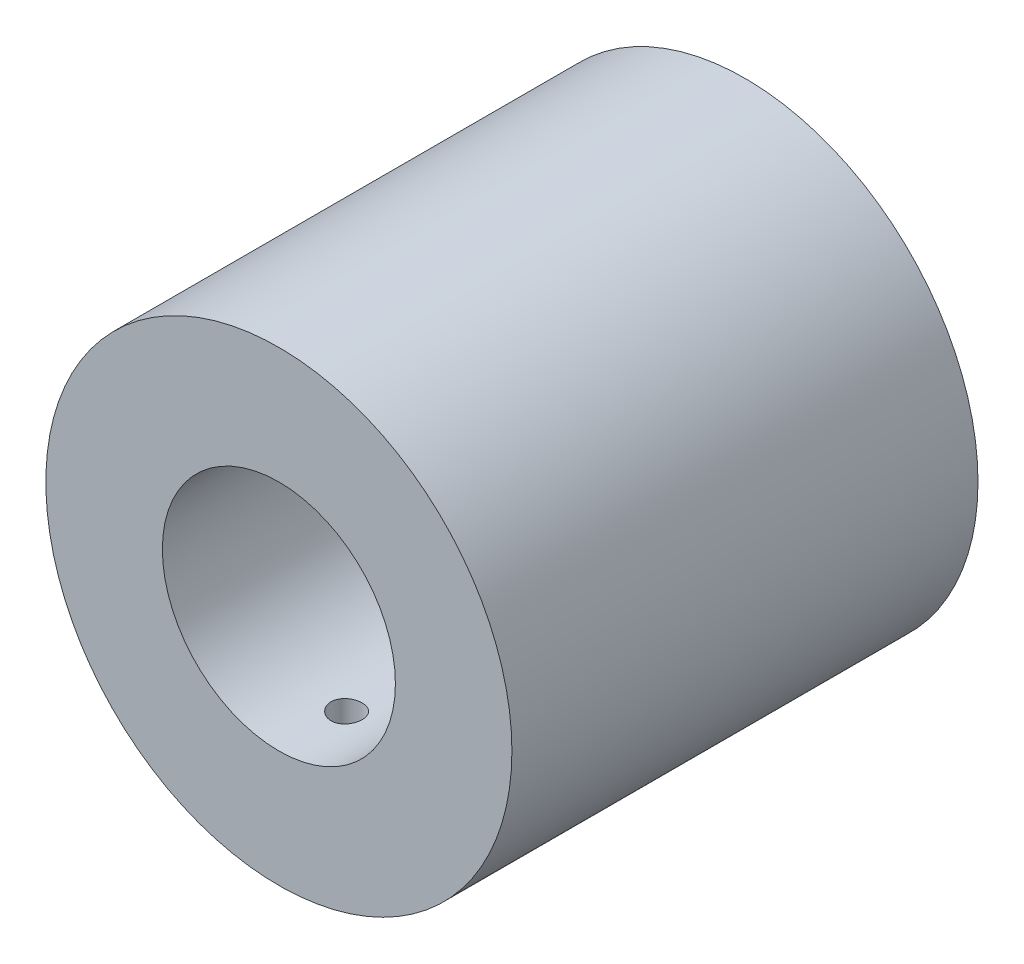
ISO-10303-21;
HEADER;
FILE_DESCRIPTION(('STEP AP214'),'2;1');
FILE_NAME('part.step','',(''),(''),'','','');
FILE_SCHEMA(('AUTOMOTIVE_DESIGN { 1 0 10303 214 1 1 1 1 }'));
ENDSEC;
DATA;
#1=APPLICATION_CONTEXT('core data for automotive mechanical design processes');
#2=APPLICATION_PROTOCOL_DEFINITION('international standard','automotive_design',2000,#1);
#3=PRODUCT_CONTEXT('',#1,'mechanical');
#4=PRODUCT('Part','Part','',(#3));
#5=PRODUCT_RELATED_PRODUCT_CATEGORY('part','',(#4));
#6=PRODUCT_DEFINITION_FORMATION('','',#4);
#7=PRODUCT_DEFINITION_CONTEXT('part definition',#1,'design');
#8=PRODUCT_DEFINITION('design','',#6,#7);
#9=PRODUCT_DEFINITION_SHAPE('','',#8);
#10=(LENGTH_UNIT() NAMED_UNIT(*) SI_UNIT(.MILLI.,.METRE.));
#11=(NAMED_UNIT(*) PLANE_ANGLE_UNIT() SI_UNIT($,.RADIAN.));
#12=(NAMED_UNIT(*) SI_UNIT($,.STERADIAN.) SOLID_ANGLE_UNIT());
#13=UNCERTAINTY_MEASURE_WITH_UNIT(LENGTH_MEASURE(1.E-05),#10,'distance_accuracy_value','');
#14=(GEOMETRIC_REPRESENTATION_CONTEXT(3) GLOBAL_UNCERTAINTY_ASSIGNED_CONTEXT((#13)) GLOBAL_UNIT_ASSIGNED_CONTEXT((#10,
#11,#12)) REPRESENTATION_CONTEXT('',''));
#15=CARTESIAN_POINT('',(0.,0.,0.));
#16=DIRECTION('',(0.,0.,1.));
#17=DIRECTION('',(1.,0.,0.));
#18=AXIS2_PLACEMENT_3D('',#15,#16,#17);
#19=CARTESIAN_POINT('',(0.,0.,30.));
#20=DIRECTION('',(0.,0.,1.));
#21=DIRECTION('',(1.,0.,0.));
#22=AXIS2_PLACEMENT_3D('',#19,#20,#21);
#23=PLANE('',#22);
#24=CARTESIAN_POINT('',(0.,0.,30.));
#25=DIRECTION('',(0.,0.,1.));
#26=DIRECTION('',(1.,0.,0.));
#27=AXIS2_PLACEMENT_3D('',#24,#25,#26);
#28=CIRCLE('',#27,15.);
#29=CARTESIAN_POINT('',(15.,0.,30.));
#30=VERTEX_POINT('',#29);
#31=EDGE_CURVE('E10',#30,#30,#28,.T.);
#32=ORIENTED_EDGE('',*,*,#31,.T.);
#33=EDGE_LOOP('',(#32));
#34=FACE_BOUND('',#33,.T.);
#35=CARTESIAN_POINT('',(0.,0.,30.));
#36=DIRECTION('',(0.,0.,1.));
#37=DIRECTION('',(1.,0.,0.));
#38=AXIS2_PLACEMENT_3D('',#35,#36,#37);
#39=CIRCLE('',#38,7.5);
#40=CARTESIAN_POINT('',(7.5,0.,30.));
#41=VERTEX_POINT('',#40);
#42=EDGE_CURVE('E51',#41,#41,#39,.T.);
#43=ORIENTED_EDGE('',*,*,#42,.F.);
#44=EDGE_LOOP('',(#43));
#45=FACE_BOUND('',#44,.T.);
#46=ADVANCED_FACE('F33',(#34,#45),#23,.T.);
#47=CARTESIAN_POINT('',(0.,0.,0.));
#48=DIRECTION('',(0.,0.,1.));
#49=DIRECTION('',(1.,0.,0.));
#50=AXIS2_PLACEMENT_3D('',#47,#48,#49);
#51=PLANE('',#50);
#52=CARTESIAN_POINT('',(0.,0.,0.));
#53=DIRECTION('',(0.,0.,1.));
#54=DIRECTION('',(1.,0.,0.));
#55=AXIS2_PLACEMENT_3D('',#52,#53,#54);
#56=CIRCLE('',#55,15.);
#57=CARTESIAN_POINT('',(15.,0.,0.));
#58=VERTEX_POINT('',#57);
#59=EDGE_CURVE('E46',#58,#58,#56,.T.);
#60=ORIENTED_EDGE('',*,*,#59,.F.);
#61=EDGE_LOOP('',(#60));
#62=FACE_BOUND('',#61,.T.);
#63=CARTESIAN_POINT('',(0.,0.,0.));
#64=DIRECTION('',(0.,0.,1.));
#65=DIRECTION('',(1.,0.,0.));
#66=AXIS2_PLACEMENT_3D('',#63,#64,#65);
#67=CIRCLE('',#66,7.5);
#68=CARTESIAN_POINT('',(7.5,0.,0.));
#69=VERTEX_POINT('',#68);
#70=EDGE_CURVE('E54',#69,#69,#67,.T.);
#71=ORIENTED_EDGE('',*,*,#70,.T.);
#72=EDGE_LOOP('',(#71));
#73=FACE_BOUND('',#72,.T.);
#74=ADVANCED_FACE('F86',(#62,#73),#51,.F.);
#75=CARTESIAN_POINT('',(0.,0.,30.));
#76=DIRECTION('',(0.,0.,-1.));
#77=DIRECTION('',(-1.,0.,0.));
#78=AXIS2_PLACEMENT_3D('',#75,#76,#77);
#79=CYLINDRICAL_SURFACE('',#78,15.);
#80=CARTESIAN_POINT('',(0.,-15.,5.36103412651882));
#81=CARTESIAN_POINT('',(0.0561035908041249,-14.9999995579846,5.36103166097059));
#82=CARTESIAN_POINT('',(0.112246272047745,-14.9996818744052,5.3562968388895));
#83=CARTESIAN_POINT('',(0.222980853460928,-14.99844511371,5.33747696678426));
#84=CARTESIAN_POINT('',(0.27757088068208,-14.9975253399424,5.32338108521855));
#85=CARTESIAN_POINT('',(0.383580167359696,-14.9951884301052,5.28624625139774));
#86=CARTESIAN_POINT('',(0.435001104032173,-14.9937715598241,5.26321207758965));
#87=CARTESIAN_POINT('',(0.53323346528299,-14.9905997328555,5.20886240934761));
#88=CARTESIAN_POINT('',(0.580045929848533,-14.9888448527116,5.1775487892304));
#89=CARTESIAN_POINT('',(0.667824599458844,-14.9851908975273,5.10747152593613));
#90=CARTESIAN_POINT('',(0.708782006678587,-14.9832916119278,5.06869687267528));
#91=CARTESIAN_POINT('',(0.783612634377517,-14.9795646978327,4.98482105472417));
#92=CARTESIAN_POINT('',(0.817485556226103,-14.9777370723604,4.93971962347659));
#93=CARTESIAN_POINT('',(0.877213460326698,-14.9743579336721,4.84441983518938));
#94=CARTESIAN_POINT('',(0.903061029326378,-14.9728066763058,4.79421682213949));
#95=CARTESIAN_POINT('',(0.945957097391599,-14.970157972686,4.69017155202204));
#96=CARTESIAN_POINT('',(0.96300570179472,-14.9690605209997,4.63632933853021));
#97=CARTESIAN_POINT('',(0.987795199392888,-14.9674452176353,4.52661968190903));
#98=CARTESIAN_POINT('',(0.995550016427559,-14.9669264989871,4.47075539791847));
#99=CARTESIAN_POINT('',(1.00157479750803,-14.9665245630443,4.35851582879268));
#100=CARTESIAN_POINT('',(0.999844881457584,-14.9666413377159,4.30214055012632));
#101=CARTESIAN_POINT('',(0.986960846772746,-14.9674964150486,4.19057425050353));
#102=CARTESIAN_POINT('',(0.975821806744587,-14.9682337232656,4.1353814795395));
#103=CARTESIAN_POINT('',(0.944459115591351,-14.9702452157825,4.02765083609035));
#104=CARTESIAN_POINT('',(0.924235403922088,-14.9715194036602,3.97511298130133));
#105=CARTESIAN_POINT('',(0.875260370110762,-14.9744622124897,3.87413515205842));
#106=CARTESIAN_POINT('',(0.846502221174381,-14.9761311489876,3.82569849822139));
#107=CARTESIAN_POINT('',(0.78127959292322,-14.9796750723207,3.7343343140076));
#108=CARTESIAN_POINT('',(0.744815014647449,-14.9815500618019,3.69140685438776));
#109=CARTESIAN_POINT('',(0.665129760832788,-14.985299217381,3.61219189179125));
#110=CARTESIAN_POINT('',(0.621896038198311,-14.9871733747298,3.57591751165685));
#111=CARTESIAN_POINT('',(0.529945441656851,-14.990706156798,3.51113966946565));
#112=CARTESIAN_POINT('',(0.481228565576779,-14.9923647814319,3.48263621048866));
#113=CARTESIAN_POINT('',(0.379686494733828,-14.9952797619227,3.43421037778455));
#114=CARTESIAN_POINT('',(0.326861055090796,-14.9965360937791,3.41428851600444));
#115=CARTESIAN_POINT('',(0.2186049960803,-14.9985046094346,3.38360022695043));
#116=CARTESIAN_POINT('',(0.163174411331704,-14.9992168004624,3.37283367805103));
#117=CARTESIAN_POINT('',(0.0513953711246012,-15.0000158534359,3.36077793226224));
#118=CARTESIAN_POINT('',(-0.00495111964684421,-15.0001039123065,3.35947059493809));
#119=CARTESIAN_POINT('',(-0.1170625716756,-14.9996479643198,3.36632296279076));
#120=CARTESIAN_POINT('',(-0.17282753638049,-14.9991039612117,3.37448261181027));
#121=CARTESIAN_POINT('',(-0.282141760529371,-14.9974458893639,3.40002230687361));
#122=CARTESIAN_POINT('',(-0.335692976508958,-14.9963323361678,3.41739401489643));
#123=CARTESIAN_POINT('',(-0.439120008014194,-14.9936604087425,3.46085623220461));
#124=CARTESIAN_POINT('',(-0.488995785972854,-14.9921020299676,3.48694683059148));
#125=CARTESIAN_POINT('',(-0.583739131383284,-14.9887124988692,3.54715228637971));
#126=CARTESIAN_POINT('',(-0.628598996013498,-14.9868809368237,3.58127924204568));
#127=CARTESIAN_POINT('',(-0.711959527646486,-14.9831524773505,3.65657108742279));
#128=CARTESIAN_POINT('',(-0.75046012362045,-14.9812555791934,3.69773605573341));
#129=CARTESIAN_POINT('',(-0.820070815484494,-14.9776067587531,3.78601374997889));
#130=CARTESIAN_POINT('',(-0.851169130356619,-14.9758550704263,3.83313577673608));
#131=CARTESIAN_POINT('',(-0.905011874107379,-14.9726979544392,3.93194330208869));
#132=CARTESIAN_POINT('',(-0.927756360237217,-14.971292524406,3.98362876940651));
#133=CARTESIAN_POINT('',(-0.964225471727894,-14.9689881146233,4.09005321781807));
#134=CARTESIAN_POINT('',(-0.977957475914838,-14.9680887206512,4.14478966103406));
#135=CARTESIAN_POINT('',(-0.996035908200023,-14.9668966664299,4.25579745807382));
#136=CARTESIAN_POINT('',(-1.0003824447804,-14.9666039991678,4.31206879414888));
#137=CARTESIAN_POINT('',(-0.999565483534788,-14.9666585741728,4.42443191615497));
#138=CARTESIAN_POINT('',(-0.994420504639091,-14.9670045703421,4.48052383827527));
#139=CARTESIAN_POINT('',(-0.974804994261808,-14.9682948425397,4.59104539398646));
#140=CARTESIAN_POINT('',(-0.960334446280208,-14.9692391196265,4.64547502463602));
#141=CARTESIAN_POINT('',(-0.92248283778284,-14.9716192360536,4.75112942078279));
#142=CARTESIAN_POINT('',(-0.899101904669178,-14.9730550683655,4.80235423209082));
#143=CARTESIAN_POINT('',(-0.844095647375272,-14.9762564813155,4.90015386843732));
#144=CARTESIAN_POINT('',(-0.812470521740287,-14.9780220540122,4.94672880542158));
#145=CARTESIAN_POINT('',(-0.741804774943629,-14.9816880295888,5.03400076551838));
#146=CARTESIAN_POINT('',(-0.702750674582998,-14.9835886735546,5.07468686385072));
#147=CARTESIAN_POINT('',(-0.618355426554708,-14.9873085213532,5.14894013578603));
#148=CARTESIAN_POINT('',(-0.573012746113305,-14.9891277051874,5.18250556874259));
#149=CARTESIAN_POINT('',(-0.477269598838892,-14.9924817745562,5.24159294406466));
#150=CARTESIAN_POINT('',(-0.426862407970513,-14.994016274223,5.26710400171267));
#151=CARTESIAN_POINT('',(-0.322506215419354,-14.9966230436255,5.30926915575046));
#152=CARTESIAN_POINT('',(-0.268561431383448,-14.9976958526619,5.3259335912224));
#153=CARTESIAN_POINT('',(-0.178573873772113,-14.9989782377769,5.34561661610703));
#154=CARTESIAN_POINT('',(-0.143112284161978,-14.9993596884566,5.35139066983633));
#155=CARTESIAN_POINT('',(-0.0717724628196567,-14.9998707107647,5.35910021069143));
#156=CARTESIAN_POINT('',(-0.0358942317520724,-15.0000002827948,5.36103570393942));
#157=CARTESIAN_POINT('',(0.,-15.,5.36103412651882));
#158=B_SPLINE_CURVE_WITH_KNOTS('',3,(#80,#81,#82,#83,#84,#85,#86,#87,#88,#89,#90,#91,#92,#93,
#94,#95,#96,#97,#98,#99,#100,#101,#102,#103,#104,#105,#106,#107,#108,#109,#110,#111,#112,#113,
#114,#115,#116,#117,#118,#119,#120,#121,#122,#123,#124,#125,#126,#127,#128,#129,#130,#131,#132,
#133,#134,#135,#136,#137,#138,#139,#140,#141,#142,#143,#144,#145,#146,#147,#148,#149,#150,#151,
#152,#153,#154,#155,#156,#157),.UNSPECIFIED.,.T.,.F.,(4,2,2,2,2,2,2,2,2,2,2,2,2,2,2,2,2,2,2,2,2,
2,2,2,2,2,2,2,2,2,2,2,2,2,2,2,2,2,4),(0.,0.168179734044292,0.336554406184462,0.504839188283248,
0.673085906323964,0.841582833287236,1.01008686142994,1.17874608173166,1.34740328286781,
1.51580748668391,1.68420956157893,1.85234227434813,2.02047610764315,2.18874479730908,
2.35701564790423,2.52561491574574,2.69421425040695,2.86282364170141,3.03143079303741,
3.19971451152963,3.36799723178317,3.53612789526984,3.70426027699717,3.87264740882398,
4.04103642129616,4.20969166582445,4.37834575448806,4.54686158747343,4.71537547265433,
4.88356091745659,5.05174665983533,5.21992999755776,5.3881092852874,5.55659668097782,
5.72512521606818,5.89388053603615,6.06243819437153,6.17003722486686,6.27763608375031),.UNSPECIFIED.);
#159=CARTESIAN_POINT('',(0.,-15.,5.36103412651882));
#160=VERTEX_POINT('',#159);
#161=EDGE_CURVE('E62',#160,#160,#158,.T.);
#162=ORIENTED_EDGE('',*,*,#161,.T.);
#163=EDGE_LOOP('',(#162));
#164=FACE_BOUND('',#163,.T.);
#165=CARTESIAN_POINT('',(0.,-15.,26.6389658734812));
#166=CARTESIAN_POINT('',(0.056103590804125,-14.9999995579846,26.6389634079329));
#167=CARTESIAN_POINT('',(0.112246272047744,-14.9996818744052,26.6342285858519));
#168=CARTESIAN_POINT('',(0.222980853460928,-14.99844511371,26.6154087137466));
#169=CARTESIAN_POINT('',(0.277570880682081,-14.9975253399424,26.6013128321809));
#170=CARTESIAN_POINT('',(0.383580167359696,-14.9951884301052,26.5641779983601));
#171=CARTESIAN_POINT('',(0.435001104032173,-14.9937715598241,26.541143824552));
#172=CARTESIAN_POINT('',(0.533233465282989,-14.9905997328555,26.48679415631));
#173=CARTESIAN_POINT('',(0.580045929848533,-14.9888448527116,26.4554805361928));
#174=CARTESIAN_POINT('',(0.667824599458843,-14.9851908975273,26.3854032728985));
#175=CARTESIAN_POINT('',(0.708782006678586,-14.9832916119278,26.3466286196376));
#176=CARTESIAN_POINT('',(0.783612634377516,-14.9795646978327,26.2627528016865));
#177=CARTESIAN_POINT('',(0.817485556226103,-14.9777370723604,26.2176513704389));
#178=CARTESIAN_POINT('',(0.877213460326698,-14.9743579336721,26.1223515821517));
#179=CARTESIAN_POINT('',(0.903061029326378,-14.9728066763058,26.0721485691019));
#180=CARTESIAN_POINT('',(0.945957097391599,-14.970157972686,25.9681032989844));
#181=CARTESIAN_POINT('',(0.963005701794719,-14.9690605209997,25.9142610854926));
#182=CARTESIAN_POINT('',(0.987795199392888,-14.9674452176353,25.8045514288714));
#183=CARTESIAN_POINT('',(0.995550016427559,-14.9669264989871,25.7486871448808));
#184=CARTESIAN_POINT('',(1.00157479750803,-14.9665245630443,25.636447575755));
#185=CARTESIAN_POINT('',(0.999844881457584,-14.9666413377159,25.5800722970887));
#186=CARTESIAN_POINT('',(0.986960846772746,-14.9674964150486,25.4685059974659));
#187=CARTESIAN_POINT('',(0.975821806744587,-14.9682337232656,25.4133132265019));
#188=CARTESIAN_POINT('',(0.944459115591351,-14.9702452157825,25.3055825830527));
#189=CARTESIAN_POINT('',(0.924235403922088,-14.9715194036602,25.2530447282637));
#190=CARTESIAN_POINT('',(0.875260370110762,-14.9744622124897,25.1520668990208));
#191=CARTESIAN_POINT('',(0.846502221174381,-14.9761311489876,25.1036302451837));
#192=CARTESIAN_POINT('',(0.78127959292322,-14.9796750723207,25.01226606097));
#193=CARTESIAN_POINT('',(0.744815014647449,-14.9815500618019,24.9693386013501));
#194=CARTESIAN_POINT('',(0.665129760832789,-14.985299217381,24.8901236387536));
#195=CARTESIAN_POINT('',(0.621896038198312,-14.9871733747298,24.8538492586192));
#196=CARTESIAN_POINT('',(0.529945441656852,-14.990706156798,24.789071416428));
#197=CARTESIAN_POINT('',(0.48122856557678,-14.9923647814319,24.760567957451));
#198=CARTESIAN_POINT('',(0.379686494733829,-14.9952797619227,24.7121421247469));
#199=CARTESIAN_POINT('',(0.326861055090798,-14.9965360937791,24.6922202629668));
#200=CARTESIAN_POINT('',(0.218604996080301,-14.9985046094346,24.6615319739128));
#201=CARTESIAN_POINT('',(0.163174411331704,-14.9992168004624,24.6507654250134));
#202=CARTESIAN_POINT('',(0.0513953711246002,-15.0000158534359,24.6387096792246));
#203=CARTESIAN_POINT('',(-0.0049511196468451,-15.0001039123065,24.6374023419004));
#204=CARTESIAN_POINT('',(-0.1170625716756,-14.9996479643198,24.6442547097531));
#205=CARTESIAN_POINT('',(-0.17282753638049,-14.9991039612117,24.6524143587726));
#206=CARTESIAN_POINT('',(-0.282141760529372,-14.9974458893639,24.677954053836));
#207=CARTESIAN_POINT('',(-0.335692976508959,-14.9963323361678,24.6953257618588));
#208=CARTESIAN_POINT('',(-0.439120008014196,-14.9936604087425,24.738787979167));
#209=CARTESIAN_POINT('',(-0.488995785972855,-14.9921020299676,24.7648785775538));
#210=CARTESIAN_POINT('',(-0.583739131383286,-14.9887124988692,24.8250840333421));
#211=CARTESIAN_POINT('',(-0.6285989960135,-14.9868809368237,24.859210989008));
#212=CARTESIAN_POINT('',(-0.711959527646489,-14.9831524773505,24.9345028343851));
#213=CARTESIAN_POINT('',(-0.750460123620452,-14.9812555791934,24.9756678026958));
#214=CARTESIAN_POINT('',(-0.820070815484495,-14.9776067587531,25.0639454969412));
#215=CARTESIAN_POINT('',(-0.851169130356619,-14.9758550704263,25.1110675236984));
#216=CARTESIAN_POINT('',(-0.905011874107379,-14.9726979544392,25.209875049051));
#217=CARTESIAN_POINT('',(-0.927756360237217,-14.971292524406,25.2615605163689));
#218=CARTESIAN_POINT('',(-0.964225471727893,-14.9689881146233,25.3679849647804));
#219=CARTESIAN_POINT('',(-0.977957475914837,-14.9680887206512,25.4227214079964));
#220=CARTESIAN_POINT('',(-0.996035908200023,-14.9668966664299,25.5337292050362));
#221=CARTESIAN_POINT('',(-1.0003824447804,-14.9666039991678,25.5900005411112));
#222=CARTESIAN_POINT('',(-0.999565483534788,-14.9666585741728,25.7023636631173));
#223=CARTESIAN_POINT('',(-0.994420504639091,-14.9670045703421,25.7584555852376));
#224=CARTESIAN_POINT('',(-0.974804994261809,-14.9682948425397,25.8689771409488));
#225=CARTESIAN_POINT('',(-0.960334446280208,-14.9692391196265,25.9234067715984));
#226=CARTESIAN_POINT('',(-0.92248283778284,-14.9716192360536,26.0290611677451));
#227=CARTESIAN_POINT('',(-0.899101904669178,-14.9730550683655,26.0802859790532));
#228=CARTESIAN_POINT('',(-0.844095647375271,-14.9762564813155,26.1780856153997));
#229=CARTESIAN_POINT('',(-0.812470521740286,-14.9780220540122,26.2246605523839));
#230=CARTESIAN_POINT('',(-0.741804774943627,-14.9816880295888,26.3119325124807));
#231=CARTESIAN_POINT('',(-0.702750674582996,-14.9835886735546,26.3526186108131));
#232=CARTESIAN_POINT('',(-0.618355426554706,-14.9873085213532,26.4268718827484));
#233=CARTESIAN_POINT('',(-0.573012746113302,-14.9891277051874,26.4604373157049));
#234=CARTESIAN_POINT('',(-0.47726959883889,-14.9924817745562,26.519524691027));
#235=CARTESIAN_POINT('',(-0.426862407970511,-14.994016274223,26.545035748675));
#236=CARTESIAN_POINT('',(-0.322506215419352,-14.9966230436255,26.5872009027128));
#237=CARTESIAN_POINT('',(-0.268561431383446,-14.9976958526619,26.6038653381848));
#238=CARTESIAN_POINT('',(-0.178573873772112,-14.9989782377769,26.6235483630694));
#239=CARTESIAN_POINT('',(-0.143112284161977,-14.9993596884566,26.6293224167987));
#240=CARTESIAN_POINT('',(-0.0717724628196561,-14.9998707107647,26.6370319576538));
#241=CARTESIAN_POINT('',(-0.0358942317520721,-15.0000002827948,26.6389674509018));
#242=CARTESIAN_POINT('',(0.,-15.,26.6389658734812));
#243=B_SPLINE_CURVE_WITH_KNOTS('',3,(#165,#166,#167,#168,#169,#170,#171,#172,#173,#174,#175,
#176,#177,#178,#179,#180,#181,#182,#183,#184,#185,#186,#187,#188,#189,#190,#191,#192,#193,#194,
#195,#196,#197,#198,#199,#200,#201,#202,#203,#204,#205,#206,#207,#208,#209,#210,#211,#212,#213,
#214,#215,#216,#217,#218,#219,#220,#221,#222,#223,#224,#225,#226,#227,#228,#229,#230,#231,#232,
#233,#234,#235,#236,#237,#238,#239,#240,#241,#242),.UNSPECIFIED.,.T.,.F.,(4,2,2,2,2,2,2,2,2,2,2,
2,2,2,2,2,2,2,2,2,2,2,2,2,2,2,2,2,2,2,2,2,2,2,2,2,2,2,4),(0.,0.168179734044292,
0.336554406184462,0.504839188283247,0.673085906323964,0.841582833287236,1.01008686142994,
1.17874608173165,1.34740328286781,1.51580748668391,1.68420956157893,1.85234227434813,
2.02047610764315,2.18874479730908,2.35701564790423,2.52561491574574,2.69421425040695,
2.86282364170141,3.03143079303741,3.19971451152963,3.36799723178317,3.53612789526984,
3.70426027699717,3.87264740882399,4.04103642129616,4.20969166582445,4.37834575448806,
4.54686158747342,4.71537547265432,4.88356091745659,5.05174665983533,5.21992999755776,
5.3881092852874,5.55659668097783,5.72512521606819,5.89388053603615,6.06243819437154,
6.17003722486686,6.27763608375031),.UNSPECIFIED.);
#244=CARTESIAN_POINT('',(0.,-15.,26.6389658734812));
#245=VERTEX_POINT('',#244);
#246=EDGE_CURVE('E61',#245,#245,#243,.T.);
#247=ORIENTED_EDGE('',*,*,#246,.T.);
#248=EDGE_LOOP('',(#247));
#249=FACE_BOUND('',#248,.T.);
#250=ORIENTED_EDGE('',*,*,#31,.F.);
#251=EDGE_LOOP('',(#250));
#252=FACE_BOUND('',#251,.T.);
#253=ORIENTED_EDGE('',*,*,#59,.T.);
#254=EDGE_LOOP('',(#253));
#255=FACE_BOUND('',#254,.T.);
#256=ADVANCED_FACE('F35',(#164,#249,#252,#255),#79,.T.);
#257=CARTESIAN_POINT('',(0.,0.,30.));
#258=DIRECTION('',(0.,0.,-1.));
#259=DIRECTION('',(-1.,0.,0.));
#260=AXIS2_PLACEMENT_3D('',#257,#258,#259);
#261=CYLINDRICAL_SURFACE('',#260,7.5);
#262=CARTESIAN_POINT('',(0.,-7.5,5.36103412651882));
#263=CARTESIAN_POINT('',(0.0559044178346421,-7.49999917871272,5.36103177166537));
#264=CARTESIAN_POINT('',(0.11184298963814,-7.49936835363597,5.35633035753759));
#265=CARTESIAN_POINT('',(0.222161362569039,-7.49691255563452,5.33765095199404));
#266=CARTESIAN_POINT('',(0.276539511166518,-7.49508636220862,5.32366347907025));
#267=CARTESIAN_POINT('',(0.382124156313492,-7.49044539924533,5.2868332677481));
#268=CARTESIAN_POINT('',(0.433332841529247,-7.48763132105486,5.2639967209996));
#269=CARTESIAN_POINT('',(0.53118194751515,-7.48132693330196,5.21013066961568));
#270=CARTESIAN_POINT('',(0.577823103168513,-7.47783673279283,5.17910248593559));
#271=CARTESIAN_POINT('',(0.665512911252339,-7.47054497394982,5.10952749571673));
#272=CARTESIAN_POINT('',(0.706528992747931,-7.46674179081055,5.07093980401459));
#273=CARTESIAN_POINT('',(0.781523678365509,-7.45926568778975,4.9874290319805));
#274=CARTESIAN_POINT('',(0.815501909986106,-7.45559277481171,4.94250561652092));
#275=CARTESIAN_POINT('',(0.875579511344537,-7.44877717720095,4.84738456504631));
#276=CARTESIAN_POINT('',(0.901648037412889,-7.44563658882881,4.79716728527951));
#277=CARTESIAN_POINT('',(0.944969225036451,-7.44026293689616,4.69301859290043));
#278=CARTESIAN_POINT('',(0.96222226622639,-7.43802983425604,4.63908734034217));
#279=CARTESIAN_POINT('',(0.987323033860869,-7.43473968284334,4.52938122126799));
#280=CARTESIAN_POINT('',(0.995226021142532,-7.43367572685068,4.47361920925236));
#281=CARTESIAN_POINT('',(1.00157340274059,-7.43282325804657,4.36155103671585));
#282=CARTESIAN_POINT('',(1.00001822816801,-7.433034687102,4.30524490111337));
#283=CARTESIAN_POINT('',(0.987538729696172,-7.43470277886495,4.19407356150486));
#284=CARTESIAN_POINT('',(0.976675487658808,-7.43615132311171,4.13920136157597));
#285=CARTESIAN_POINT('',(0.945983623171857,-7.44011776387373,4.03206570813878));
#286=CARTESIAN_POINT('',(0.926154796307286,-7.44263568477064,3.97980231414132));
#287=CARTESIAN_POINT('',(0.878029645715955,-7.44846630555513,3.87917930916522));
#288=CARTESIAN_POINT('',(0.849706989568746,-7.45178147061949,3.83083244092167));
#289=CARTESIAN_POINT('',(0.785416966721446,-7.45883118109967,3.73955458555999));
#290=CARTESIAN_POINT('',(0.749449202511925,-7.46256574831765,3.69662388024174));
#291=CARTESIAN_POINT('',(0.670552450131812,-7.47006949616793,3.61704262022787));
#292=CARTESIAN_POINT('',(0.627570853513223,-7.47383871770599,3.58044420516766));
#293=CARTESIAN_POINT('',(0.536047085066704,-7.48095961909132,3.51497310405463));
#294=CARTESIAN_POINT('',(0.487504897221185,-7.48431129773577,3.48610044025706));
#295=CARTESIAN_POINT('',(0.386196109865235,-7.4902219687179,3.43689956767145));
#296=CARTESIAN_POINT('',(0.333427789420615,-7.49278063604478,3.41657486099567));
#297=CARTESIAN_POINT('',(0.225185462168124,-7.49681412952036,3.38508946703265));
#298=CARTESIAN_POINT('',(0.169711599771128,-7.49828901344964,3.37392829119913));
#299=CARTESIAN_POINT('',(0.0580834516628215,-7.49998120688428,3.36115491013326));
#300=CARTESIAN_POINT('',(0.00193751727352076,-7.50020796924523,3.35947092562708));
#301=CARTESIAN_POINT('',(-0.109835808609359,-7.49940395769259,3.36550995858241));
#302=CARTESIAN_POINT('',(-0.165463212672832,-7.49837321434299,3.37323274741));
#303=CARTESIAN_POINT('',(-0.274406857786469,-7.4951758767905,3.39780645321081));
#304=CARTESIAN_POINT('',(-0.327731008256023,-7.49301357151461,3.4146229106799));
#305=CARTESIAN_POINT('',(-0.43080254939678,-7.48779504627144,3.45687060948737));
#306=CARTESIAN_POINT('',(-0.480549803507819,-7.4847387921972,3.48230217952545));
#307=CARTESIAN_POINT('',(-0.575374439308039,-7.47804918685037,3.54123020431048));
#308=CARTESIAN_POINT('',(-0.620422907198302,-7.47441257522858,3.57477280937549));
#309=CARTESIAN_POINT('',(-0.704276473495948,-7.46697864354991,3.64890579113095));
#310=CARTESIAN_POINT('',(-0.743081288311892,-7.4631813162031,3.68949648777704));
#311=CARTESIAN_POINT('',(-0.813602747115491,-7.45582451236755,3.7768906978386));
#312=CARTESIAN_POINT('',(-0.845271638044691,-7.45226674387649,3.8237329098879));
#313=CARTESIAN_POINT('',(-0.90029175539407,-7.44582066500909,3.92211383165929));
#314=CARTESIAN_POINT('',(-0.923643167551733,-7.44293233968392,3.97365243647401));
#315=CARTESIAN_POINT('',(-0.961289182503731,-7.43816405890039,4.07981274753267));
#316=CARTESIAN_POINT('',(-0.975610144233977,-7.43628117116299,4.13442496912423));
#317=CARTESIAN_POINT('',(-0.994873335719794,-7.43372874349146,4.2453059425832));
#318=CARTESIAN_POINT('',(-0.999816067133909,-7.43305913865671,4.30157460568104));
#319=CARTESIAN_POINT('',(-1.00017242903095,-7.43301115647724,4.41369587194558));
#320=CARTESIAN_POINT('',(-0.995661095972463,-7.4336226114126,4.46954824700095));
#321=CARTESIAN_POINT('',(-0.977396883433445,-7.43604591937099,4.57969306407076));
#322=CARTESIAN_POINT('',(-0.963644007416343,-7.43785777194415,4.63398550666981));
#323=CARTESIAN_POINT('',(-0.927311551661036,-7.44247445136382,4.73945596814462));
#324=CARTESIAN_POINT('',(-0.904736104095205,-7.445278813297,4.79063543207725));
#325=CARTESIAN_POINT('',(-0.851406713798686,-7.45156522856411,4.88849206843185));
#326=CARTESIAN_POINT('',(-0.820652613152143,-7.45504729498301,4.93516915389684));
#327=CARTESIAN_POINT('',(-0.751562242547542,-7.46232983591531,5.02307895148303));
#328=CARTESIAN_POINT('',(-0.713170136134505,-7.46613252877041,5.06426760039639));
#329=CARTESIAN_POINT('',(-0.630010846749118,-7.47360859500832,5.1396457346996));
#330=CARTESIAN_POINT('',(-0.585242170364888,-7.47728193784489,5.17383357589395));
#331=CARTESIAN_POINT('',(-0.490376493926411,-7.48410317568764,5.23436769575208));
#332=CARTESIAN_POINT('',(-0.440257310371983,-7.48724873213445,5.26067945979645));
#333=CARTESIAN_POINT('',(-0.336296204793664,-7.49263660329486,5.30447442579136));
#334=CARTESIAN_POINT('',(-0.282458339484944,-7.49487988462156,5.32196708083125));
#335=CARTESIAN_POINT('',(-0.190294204049209,-7.49767860871633,5.34350812971141));
#336=CARTESIAN_POINT('',(-0.152545540977889,-7.49854481817537,5.35007074828064));
#337=CARTESIAN_POINT('',(-0.076536585808056,-7.49970579245385,5.35883453360156));
#338=CARTESIAN_POINT('',(-0.0382762982256202,-7.500000562314,5.36103573882562));
#339=CARTESIAN_POINT('',(0.,-7.5,5.36103412651882));
#340=B_SPLINE_CURVE_WITH_KNOTS('',3,(#262,#263,#264,#265,#266,#267,#268,#269,#270,#271,#272,
#273,#274,#275,#276,#277,#278,#279,#280,#281,#282,#283,#284,#285,#286,#287,#288,#289,#290,#291,
#292,#293,#294,#295,#296,#297,#298,#299,#300,#301,#302,#303,#304,#305,#306,#307,#308,#309,#310,
#311,#312,#313,#314,#315,#316,#317,#318,#319,#320,#321,#322,#323,#324,#325,#326,#327,#328,#329,
#330,#331,#332,#333,#334,#335,#336,#337,#338,#339),.UNSPECIFIED.,.T.,.F.,(4,2,2,2,2,2,2,2,2,2,2,
2,2,2,2,2,2,2,2,2,2,2,2,2,2,2,2,2,2,2,2,2,2,2,2,2,2,2,4),(0.,0.167573425652872,
0.335318215442522,0.502945846413703,0.670546462820173,0.839079892217795,1.00762223952418,
1.17681360755824,1.34599768883102,1.5141767795718,1.6823482046246,1.84942442549022,
2.01650445587925,2.18410791568949,2.35172009221899,2.52065272242425,2.68958583926148,
2.85858810101269,3.02758135195871,3.1952929249603,3.36300042177239,3.53007681698232,
3.69715958751773,3.86521637384942,4.03328079129381,4.20243852267725,4.37159247636524,
4.54025037367727,4.70889924891817,4.87621463748312,5.04352996334373,5.21076701851311,
5.37800730297951,5.54651833917553,5.7150689062558,5.88434763337258,6.05344452496209,
6.16817869523654,6.28291185342719),.UNSPECIFIED.);
#341=CARTESIAN_POINT('',(0.,-7.5,5.36103412651882));
#342=VERTEX_POINT('',#341);
#343=EDGE_CURVE('E38',#342,#342,#340,.T.);
#344=ORIENTED_EDGE('',*,*,#343,.F.);
#345=EDGE_LOOP('',(#344));
#346=FACE_BOUND('',#345,.T.);
#347=CARTESIAN_POINT('',(0.,-7.5,26.6389658734812));
#348=CARTESIAN_POINT('',(0.0559044178346423,-7.49999917871272,26.6389635186277));
#349=CARTESIAN_POINT('',(0.11184298963814,-7.49936835363597,26.6342621044999));
#350=CARTESIAN_POINT('',(0.22216136256904,-7.49691255563452,26.6155826989564));
#351=CARTESIAN_POINT('',(0.276539511166518,-7.49508636220862,26.6015952260326));
#352=CARTESIAN_POINT('',(0.382124156313492,-7.49044539924533,26.5647650147104));
#353=CARTESIAN_POINT('',(0.433332841529248,-7.48763132105486,26.541928467962));
#354=CARTESIAN_POINT('',(0.531181947515151,-7.48132693330196,26.488062416578));
#355=CARTESIAN_POINT('',(0.577823103168514,-7.47783673279283,26.4570342328979));
#356=CARTESIAN_POINT('',(0.66551291125234,-7.47054497394982,26.3874592426791));
#357=CARTESIAN_POINT('',(0.706528992747932,-7.46674179081055,26.3488715509769));
#358=CARTESIAN_POINT('',(0.781523678365509,-7.45926568778975,26.2653607789428));
#359=CARTESIAN_POINT('',(0.815501909986106,-7.45559277481171,26.2204373634833));
#360=CARTESIAN_POINT('',(0.875579511344537,-7.44877717720095,26.1253163120087));
#361=CARTESIAN_POINT('',(0.90164803741289,-7.44563658882881,26.0750990322419));
#362=CARTESIAN_POINT('',(0.944969225036452,-7.44026293689616,25.9709503398628));
#363=CARTESIAN_POINT('',(0.96222226622639,-7.43802983425604,25.9170190873045));
#364=CARTESIAN_POINT('',(0.987323033860869,-7.43473968284334,25.8073129682303));
#365=CARTESIAN_POINT('',(0.995226021142533,-7.43367572685068,25.7515509562147));
#366=CARTESIAN_POINT('',(1.00157340274059,-7.43282325804657,25.6394827836782));
#367=CARTESIAN_POINT('',(1.00001822816801,-7.433034687102,25.5831766480757));
#368=CARTESIAN_POINT('',(0.987538729696172,-7.43470277886495,25.4720053084672));
#369=CARTESIAN_POINT('',(0.976675487658808,-7.43615132311171,25.4171331085383));
#370=CARTESIAN_POINT('',(0.945983623171857,-7.44011776387373,25.3099974551011));
#371=CARTESIAN_POINT('',(0.926154796307286,-7.44263568477064,25.2577340611037));
#372=CARTESIAN_POINT('',(0.878029645715956,-7.44846630555513,25.1571110561276));
#373=CARTESIAN_POINT('',(0.849706989568747,-7.45178147061949,25.108764187884));
#374=CARTESIAN_POINT('',(0.785416966721447,-7.45883118109967,25.0174863325223));
#375=CARTESIAN_POINT('',(0.749449202511925,-7.46256574831765,24.9745556272041));
#376=CARTESIAN_POINT('',(0.670552450131811,-7.47006949616793,24.8949743671902));
#377=CARTESIAN_POINT('',(0.627570853513223,-7.47383871770599,24.85837595213));
#378=CARTESIAN_POINT('',(0.536047085066704,-7.48095961909132,24.792904851017));
#379=CARTESIAN_POINT('',(0.487504897221184,-7.48431129773577,24.7640321872194));
#380=CARTESIAN_POINT('',(0.386196109865234,-7.4902219687179,24.7148313146338));
#381=CARTESIAN_POINT('',(0.333427789420615,-7.49278063604478,24.694506607958));
#382=CARTESIAN_POINT('',(0.225185462168124,-7.49681412952036,24.663021213995));
#383=CARTESIAN_POINT('',(0.169711599771127,-7.49828901344964,24.6518600381615));
#384=CARTESIAN_POINT('',(0.0580834516628196,-7.49998120688428,24.6390866570956));
#385=CARTESIAN_POINT('',(0.00193751727351911,-7.50020796924523,24.6374026725894));
#386=CARTESIAN_POINT('',(-0.10983580860936,-7.49940395769259,24.6434417055448));
#387=CARTESIAN_POINT('',(-0.165463212672834,-7.49837321434299,24.6511644943724));
#388=CARTESIAN_POINT('',(-0.27440685778647,-7.4951758767905,24.6757382001732));
#389=CARTESIAN_POINT('',(-0.327731008256023,-7.49301357151461,24.6925546576423));
#390=CARTESIAN_POINT('',(-0.430802549396781,-7.48779504627144,24.7348023564497));
#391=CARTESIAN_POINT('',(-0.48054980350782,-7.4847387921972,24.7602339264878));
#392=CARTESIAN_POINT('',(-0.57537443930804,-7.47804918685037,24.8191619512728));
#393=CARTESIAN_POINT('',(-0.620422907198303,-7.47441257522858,24.8527045563378));
#394=CARTESIAN_POINT('',(-0.704276473495949,-7.46697864354991,24.9268375380933));
#395=CARTESIAN_POINT('',(-0.743081288311893,-7.4631813162031,24.9674282347394));
#396=CARTESIAN_POINT('',(-0.81360274711549,-7.45582451236755,25.054822444801));
#397=CARTESIAN_POINT('',(-0.845271638044691,-7.45226674387649,25.1016646568503));
#398=CARTESIAN_POINT('',(-0.90029175539407,-7.44582066500909,25.2000455786216));
#399=CARTESIAN_POINT('',(-0.923643167551733,-7.44293233968392,25.2515841834364));
#400=CARTESIAN_POINT('',(-0.961289182503731,-7.43816405890039,25.357744494495));
#401=CARTESIAN_POINT('',(-0.975610144233978,-7.43628117116299,25.4123567160866));
#402=CARTESIAN_POINT('',(-0.994873335719794,-7.43372874349146,25.5232376895456));
#403=CARTESIAN_POINT('',(-0.999816067133909,-7.43305913865671,25.5795063526434));
#404=CARTESIAN_POINT('',(-1.00017242903095,-7.43301115647724,25.6916276189079));
#405=CARTESIAN_POINT('',(-0.995661095972463,-7.4336226114126,25.7474799939633));
#406=CARTESIAN_POINT('',(-0.977396883433446,-7.43604591937099,25.8576248110331));
#407=CARTESIAN_POINT('',(-0.963644007416343,-7.43785777194415,25.9119172536322));
#408=CARTESIAN_POINT('',(-0.927311551661036,-7.44247445136382,26.017387715107));
#409=CARTESIAN_POINT('',(-0.904736104095207,-7.445278813297,26.0685671790396));
#410=CARTESIAN_POINT('',(-0.851406713798688,-7.45156522856411,26.1664238153942));
#411=CARTESIAN_POINT('',(-0.820652613152144,-7.45504729498301,26.2131009008592));
#412=CARTESIAN_POINT('',(-0.751562242547541,-7.46232983591531,26.3010106984454));
#413=CARTESIAN_POINT('',(-0.713170136134503,-7.46613252877041,26.3421993473587));
#414=CARTESIAN_POINT('',(-0.630010846749117,-7.47360859500832,26.4175774816619));
#415=CARTESIAN_POINT('',(-0.585242170364888,-7.47728193784489,26.4517653228563));
#416=CARTESIAN_POINT('',(-0.490376493926412,-7.48410317568764,26.5122994427144));
#417=CARTESIAN_POINT('',(-0.440257310371983,-7.48724873213445,26.5386112067588));
#418=CARTESIAN_POINT('',(-0.336296204793664,-7.49263660329486,26.5824061727537));
#419=CARTESIAN_POINT('',(-0.282458339484944,-7.49487988462156,26.5998988277936));
#420=CARTESIAN_POINT('',(-0.190294204049209,-7.49767860871633,26.6214398766738));
#421=CARTESIAN_POINT('',(-0.152545540977888,-7.49854481817537,26.628002495243));
#422=CARTESIAN_POINT('',(-0.0765365858080551,-7.49970579245385,26.6367662805639));
#423=CARTESIAN_POINT('',(-0.0382762982256198,-7.500000562314,26.638967485788));
#424=CARTESIAN_POINT('',(0.,-7.5,26.6389658734812));
#425=B_SPLINE_CURVE_WITH_KNOTS('',3,(#347,#348,#349,#350,#351,#352,#353,#354,#355,#356,#357,
#358,#359,#360,#361,#362,#363,#364,#365,#366,#367,#368,#369,#370,#371,#372,#373,#374,#375,#376,
#377,#378,#379,#380,#381,#382,#383,#384,#385,#386,#387,#388,#389,#390,#391,#392,#393,#394,#395,
#396,#397,#398,#399,#400,#401,#402,#403,#404,#405,#406,#407,#408,#409,#410,#411,#412,#413,#414,
#415,#416,#417,#418,#419,#420,#421,#422,#423,#424),.UNSPECIFIED.,.T.,.F.,(4,2,2,2,2,2,2,2,2,2,2,
2,2,2,2,2,2,2,2,2,2,2,2,2,2,2,2,2,2,2,2,2,2,2,2,2,2,2,4),(0.,0.167573425652872,
0.335318215442523,0.502945846413703,0.670546462820174,0.839079892217794,1.00762223952418,
1.17681360755824,1.34599768883103,1.5141767795718,1.6823482046246,1.84942442549022,
2.01650445587925,2.18410791568949,2.35172009221899,2.52065272242425,2.68958583926148,
2.85858810101269,3.02758135195872,3.19529292496031,3.36300042177239,3.53007681698232,
3.69715958751773,3.86521637384942,4.03328079129381,4.20243852267725,4.37159247636524,
4.54025037367727,4.70889924891817,4.87621463748312,5.04352996334372,5.2107670185131,
5.37800730297951,5.54651833917554,5.7150689062558,5.88434763337258,6.05344452496209,
6.16817869523654,6.28291185342719),.UNSPECIFIED.);
#426=CARTESIAN_POINT('',(0.,-7.5,26.6389658734812));
#427=VERTEX_POINT('',#426);
#428=EDGE_CURVE('E56',#427,#427,#425,.T.);
#429=ORIENTED_EDGE('',*,*,#428,.F.);
#430=EDGE_LOOP('',(#429));
#431=FACE_BOUND('',#430,.T.);
#432=ORIENTED_EDGE('',*,*,#42,.T.);
#433=EDGE_LOOP('',(#432));
#434=FACE_BOUND('',#433,.T.);
#435=ORIENTED_EDGE('',*,*,#70,.F.);
#436=EDGE_LOOP('',(#435));
#437=FACE_BOUND('',#436,.T.);
#438=ADVANCED_FACE('F63',(#346,#431,#434,#437),#261,.F.);
#439=CARTESIAN_POINT('',(0.,-30.,25.6389658734812));
#440=DIRECTION('',(0.,1.,0.));
#441=DIRECTION('',(0.,0.,1.));
#442=AXIS2_PLACEMENT_3D('',#439,#440,#441);
#443=CYLINDRICAL_SURFACE('',#442,1.);
#444=ORIENTED_EDGE('',*,*,#428,.T.);
#445=EDGE_LOOP('',(#444));
#446=FACE_BOUND('',#445,.T.);
#447=ORIENTED_EDGE('',*,*,#246,.F.);
#448=EDGE_LOOP('',(#447));
#449=FACE_BOUND('',#448,.T.);
#450=ADVANCED_FACE('F66',(#446,#449),#443,.F.);
#451=CARTESIAN_POINT('',(0.,-30.,4.36103412651882));
#452=DIRECTION('',(0.,1.,0.));
#453=DIRECTION('',(0.,0.,1.));
#454=AXIS2_PLACEMENT_3D('',#451,#452,#453);
#455=CYLINDRICAL_SURFACE('',#454,1.);
#456=ORIENTED_EDGE('',*,*,#343,.T.);
#457=EDGE_LOOP('',(#456));
#458=FACE_BOUND('',#457,.T.);
#459=ORIENTED_EDGE('',*,*,#161,.F.);
#460=EDGE_LOOP('',(#459));
#461=FACE_BOUND('',#460,.T.);
#462=ADVANCED_FACE('F69',(#458,#461),#455,.F.);
#463=CLOSED_SHELL('',(#46,#74,#256,#438,#450,#462));
#464=MANIFOLD_SOLID_BREP('B2',#463);
#465=ADVANCED_BREP_SHAPE_REPRESENTATION('',(#18,#464),#14);
#466=SHAPE_DEFINITION_REPRESENTATION(#9,#465);
ENDSEC;
END-ISO-10303-21;
